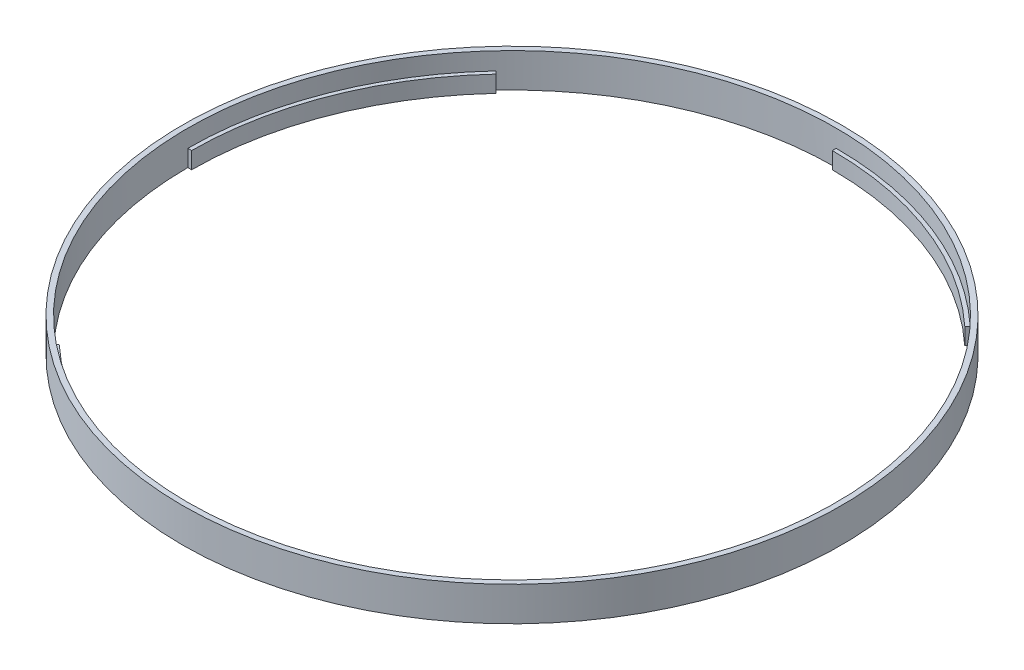
ISO-10303-21;
HEADER;
FILE_DESCRIPTION(('STEP AP214'),'2;1');
FILE_NAME('part.step','',(''),(''),'','','');
FILE_SCHEMA(('AUTOMOTIVE_DESIGN { 1 0 10303 214 1 1 1 1 }'));
ENDSEC;
DATA;
#1=APPLICATION_CONTEXT('core data for automotive mechanical design processes');
#2=APPLICATION_PROTOCOL_DEFINITION('international standard','automotive_design',2000,#1);
#3=PRODUCT_CONTEXT('',#1,'mechanical');
#4=PRODUCT('Part','Part','',(#3));
#5=PRODUCT_RELATED_PRODUCT_CATEGORY('part','',(#4));
#6=PRODUCT_DEFINITION_FORMATION('','',#4);
#7=PRODUCT_DEFINITION_CONTEXT('part definition',#1,'design');
#8=PRODUCT_DEFINITION('design','',#6,#7);
#9=PRODUCT_DEFINITION_SHAPE('','',#8);
#10=(LENGTH_UNIT() NAMED_UNIT(*) SI_UNIT(.MILLI.,.METRE.));
#11=(NAMED_UNIT(*) PLANE_ANGLE_UNIT() SI_UNIT($,.RADIAN.));
#12=(NAMED_UNIT(*) SI_UNIT($,.STERADIAN.) SOLID_ANGLE_UNIT());
#13=UNCERTAINTY_MEASURE_WITH_UNIT(LENGTH_MEASURE(1.E-05),#10,'distance_accuracy_value','');
#14=(GEOMETRIC_REPRESENTATION_CONTEXT(3) GLOBAL_UNCERTAINTY_ASSIGNED_CONTEXT((#13)) GLOBAL_UNIT_ASSIGNED_CONTEXT((#10,
#11,#12)) REPRESENTATION_CONTEXT('',''));
#15=CARTESIAN_POINT('',(0.,0.,0.));
#16=DIRECTION('',(0.,0.,1.));
#17=DIRECTION('',(1.,0.,0.));
#18=AXIS2_PLACEMENT_3D('',#15,#16,#17);
#19=CARTESIAN_POINT('',(0.,8.,0.));
#20=DIRECTION('',(0.,-1.,0.));
#21=DIRECTION('',(0.,0.,-1.));
#22=AXIS2_PLACEMENT_3D('',#19,#20,#21);
#23=CYLINDRICAL_SURFACE('',#22,75.75);
#24=CARTESIAN_POINT('',(0.,8.,0.));
#25=DIRECTION('',(0.,1.,0.));
#26=DIRECTION('',(0.,0.,1.));
#27=AXIS2_PLACEMENT_3D('',#24,#25,#26);
#28=CIRCLE('',#27,75.75);
#29=CARTESIAN_POINT('',(0.,8.,75.75));
#30=VERTEX_POINT('',#29);
#31=EDGE_CURVE('E255',#30,#30,#28,.T.);
#32=ORIENTED_EDGE('',*,*,#31,.T.);
#33=EDGE_LOOP('',(#32));
#34=FACE_BOUND('',#33,.T.);
#35=CARTESIAN_POINT('',(0.,0.,0.));
#36=DIRECTION('',(0.,1.,0.));
#37=DIRECTION('',(0.,0.,1.));
#38=AXIS2_PLACEMENT_3D('',#35,#36,#37);
#39=CIRCLE('',#38,75.75);
#40=CARTESIAN_POINT('',(-75.75,0.,0.));
#41=VERTEX_POINT('',#40);
#42=CARTESIAN_POINT('',(-51.6613757747343,0.,55.4000428976521));
#43=VERTEX_POINT('',#42);
#44=EDGE_CURVE('E169',#41,#43,#39,.T.);
#45=ORIENTED_EDGE('',*,*,#44,.F.);
#46=DIRECTION('',(0.,-1.,0.));
#47=VECTOR('',#46,1.);
#48=CARTESIAN_POINT('',(-75.75,3.9,0.));
#49=LINE('',#48,#47);
#50=CARTESIAN_POINT('',(-75.75,3.9,0.));
#51=VERTEX_POINT('',#50);
#52=EDGE_CURVE('E52',#51,#41,#49,.T.);
#53=ORIENTED_EDGE('',*,*,#52,.F.);
#54=CARTESIAN_POINT('',(0.,3.9,0.));
#55=DIRECTION('',(0.,1.,0.));
#56=DIRECTION('',(0.,0.,1.));
#57=AXIS2_PLACEMENT_3D('',#54,#55,#56);
#58=CIRCLE('',#57,75.75);
#59=CARTESIAN_POINT('',(-55.4000428976521,3.9,-51.6613757747343));
#60=VERTEX_POINT('',#59);
#61=EDGE_CURVE('E156',#60,#51,#58,.T.);
#62=ORIENTED_EDGE('',*,*,#61,.F.);
#63=DIRECTION('',(0.,-1.,0.));
#64=VECTOR('',#63,1.);
#65=CARTESIAN_POINT('',(-55.4000428976521,3.9,-51.6613757747343));
#66=LINE('',#65,#64);
#67=CARTESIAN_POINT('',(-55.4000428976521,0.,-51.6613757747343));
#68=VERTEX_POINT('',#67);
#69=EDGE_CURVE('E301',#60,#68,#66,.T.);
#70=ORIENTED_EDGE('',*,*,#69,.T.);
#71=CARTESIAN_POINT('',(0.,0.,-75.75));
#72=VERTEX_POINT('',#71);
#73=EDGE_CURVE('E258',#72,#68,#39,.T.);
#74=ORIENTED_EDGE('',*,*,#73,.F.);
#75=DIRECTION('',(0.,-1.,0.));
#76=VECTOR('',#75,1.);
#77=CARTESIAN_POINT('',(0.,3.9,-75.75));
#78=LINE('',#77,#76);
#79=CARTESIAN_POINT('',(0.,3.9,-75.75));
#80=VERTEX_POINT('',#79);
#81=EDGE_CURVE('E252',#80,#72,#78,.T.);
#82=ORIENTED_EDGE('',*,*,#81,.F.);
#83=CARTESIAN_POINT('',(0.,3.9,0.));
#84=DIRECTION('',(0.,1.,0.));
#85=DIRECTION('',(0.,0.,1.));
#86=AXIS2_PLACEMENT_3D('',#83,#84,#85);
#87=CIRCLE('',#86,75.75);
#88=CARTESIAN_POINT('',(51.6613757747343,3.9,-55.4000428976521));
#89=VERTEX_POINT('',#88);
#90=EDGE_CURVE('E228',#89,#80,#87,.T.);
#91=ORIENTED_EDGE('',*,*,#90,.F.);
#92=DIRECTION('',(0.,-1.,0.));
#93=VECTOR('',#92,1.);
#94=CARTESIAN_POINT('',(51.6613757747343,3.9,-55.4000428976521));
#95=LINE('',#94,#93);
#96=CARTESIAN_POINT('',(51.6613757747343,0.,-55.4000428976521));
#97=VERTEX_POINT('',#96);
#98=EDGE_CURVE('E238',#89,#97,#95,.T.);
#99=ORIENTED_EDGE('',*,*,#98,.T.);
#100=CARTESIAN_POINT('',(75.75,0.,0.));
#101=VERTEX_POINT('',#100);
#102=EDGE_CURVE('E254',#101,#97,#39,.T.);
#103=ORIENTED_EDGE('',*,*,#102,.F.);
#104=DIRECTION('',(0.,-1.,0.));
#105=VECTOR('',#104,1.);
#106=CARTESIAN_POINT('',(75.75,3.9,0.));
#107=LINE('',#106,#105);
#108=CARTESIAN_POINT('',(75.75,3.9,0.));
#109=VERTEX_POINT('',#108);
#110=EDGE_CURVE('E225',#109,#101,#107,.T.);
#111=ORIENTED_EDGE('',*,*,#110,.F.);
#112=CARTESIAN_POINT('',(0.,3.9,0.));
#113=DIRECTION('',(0.,1.,0.));
#114=DIRECTION('',(0.,0.,1.));
#115=AXIS2_PLACEMENT_3D('',#112,#113,#114);
#116=CIRCLE('',#115,75.75);
#117=CARTESIAN_POINT('',(55.4000428976521,3.9,51.6613757747343));
#118=VERTEX_POINT('',#117);
#119=EDGE_CURVE('E201',#118,#109,#116,.T.);
#120=ORIENTED_EDGE('',*,*,#119,.F.);
#121=DIRECTION('',(0.,-1.,0.));
#122=VECTOR('',#121,1.);
#123=CARTESIAN_POINT('',(55.4000428976521,3.9,51.6613757747343));
#124=LINE('',#123,#122);
#125=CARTESIAN_POINT('',(55.4000428976521,0.,51.6613757747343));
#126=VERTEX_POINT('',#125);
#127=EDGE_CURVE('E211',#118,#126,#124,.T.);
#128=ORIENTED_EDGE('',*,*,#127,.T.);
#129=CARTESIAN_POINT('',(0.,0.,75.75));
#130=VERTEX_POINT('',#129);
#131=EDGE_CURVE('E264',#130,#126,#39,.T.);
#132=ORIENTED_EDGE('',*,*,#131,.F.);
#133=DIRECTION('',(0.,-1.,0.));
#134=VECTOR('',#133,1.);
#135=CARTESIAN_POINT('',(0.,3.9,75.75));
#136=LINE('',#135,#134);
#137=CARTESIAN_POINT('',(0.,3.9,75.75));
#138=VERTEX_POINT('',#137);
#139=EDGE_CURVE('E60',#138,#130,#136,.T.);
#140=ORIENTED_EDGE('',*,*,#139,.F.);
#141=CARTESIAN_POINT('',(0.,3.9,0.));
#142=DIRECTION('',(0.,1.,0.));
#143=DIRECTION('',(0.,0.,1.));
#144=AXIS2_PLACEMENT_3D('',#141,#142,#143);
#145=CIRCLE('',#144,75.75);
#146=CARTESIAN_POINT('',(-51.6613757747343,3.9,55.4000428976521));
#147=VERTEX_POINT('',#146);
#148=EDGE_CURVE('E178',#147,#138,#145,.T.);
#149=ORIENTED_EDGE('',*,*,#148,.F.);
#150=DIRECTION('',(0.,-1.,0.));
#151=VECTOR('',#150,1.);
#152=CARTESIAN_POINT('',(-51.6613757747343,3.9,55.4000428976521));
#153=LINE('',#152,#151);
#154=EDGE_CURVE('E187',#147,#43,#153,.T.);
#155=ORIENTED_EDGE('',*,*,#154,.T.);
#156=EDGE_LOOP('',(#45,#53,#62,#70,#74,#82,#91,#99,#103,#111,#120,#128,#132,#140,#149,#155));
#157=FACE_BOUND('',#156,.T.);
#158=ADVANCED_FACE('F37',(#34,#157),#23,.F.);
#159=CARTESIAN_POINT('',(0.,8.,0.));
#160=DIRECTION('',(0.,1.,0.));
#161=DIRECTION('',(0.,0.,1.));
#162=AXIS2_PLACEMENT_3D('',#159,#160,#161);
#163=PLANE('',#162);
#164=CARTESIAN_POINT('',(0.,8.,0.));
#165=DIRECTION('',(0.,1.,0.));
#166=DIRECTION('',(0.,0.,1.));
#167=AXIS2_PLACEMENT_3D('',#164,#165,#166);
#168=CIRCLE('',#167,77.);
#169=CARTESIAN_POINT('',(0.,8.,77.));
#170=VERTEX_POINT('',#169);
#171=EDGE_CURVE('E11',#170,#170,#168,.T.);
#172=ORIENTED_EDGE('',*,*,#171,.T.);
#173=EDGE_LOOP('',(#172));
#174=FACE_BOUND('',#173,.T.);
#175=ORIENTED_EDGE('',*,*,#31,.F.);
#176=EDGE_LOOP('',(#175));
#177=FACE_BOUND('',#176,.T.);
#178=ADVANCED_FACE('F326',(#174,#177),#163,.T.);
#179=CARTESIAN_POINT('',(0.,0.,0.));
#180=DIRECTION('',(0.,1.,0.));
#181=DIRECTION('',(0.,0.,1.));
#182=AXIS2_PLACEMENT_3D('',#179,#180,#181);
#183=PLANE('',#182);
#184=CARTESIAN_POINT('',(0.,0.,0.));
#185=DIRECTION('',(0.,1.,0.));
#186=DIRECTION('',(0.,0.,1.));
#187=AXIS2_PLACEMENT_3D('',#184,#185,#186);
#188=CIRCLE('',#187,77.);
#189=CARTESIAN_POINT('',(0.,0.,77.));
#190=VERTEX_POINT('',#189);
#191=EDGE_CURVE('E41',#190,#190,#188,.T.);
#192=ORIENTED_EDGE('',*,*,#191,.F.);
#193=EDGE_LOOP('',(#192));
#194=FACE_BOUND('',#193,.T.);
#195=ORIENTED_EDGE('',*,*,#73,.T.);
#196=DIRECTION('',(-0.731353701619181,0.,-0.681998360062487));
#197=VECTOR('',#196,1.);
#198=CARTESIAN_POINT('',(-55.4000428976521,0.,-51.6613757747343));
#199=LINE('',#198,#197);
#200=CARTESIAN_POINT('',(-54.7418245661948,0.,-51.0475772506781));
#201=VERTEX_POINT('',#200);
#202=EDGE_CURVE('E165',#201,#68,#199,.T.);
#203=ORIENTED_EDGE('',*,*,#202,.F.);
#204=CARTESIAN_POINT('',(0.,0.,0.));
#205=DIRECTION('',(0.,-1.,0.));
#206=DIRECTION('',(0.,0.,1.));
#207=AXIS2_PLACEMENT_3D('',#204,#205,#206);
#208=CIRCLE('',#207,74.85);
#209=CARTESIAN_POINT('',(-74.85,0.,0.));
#210=VERTEX_POINT('',#209);
#211=EDGE_CURVE('E308',#210,#201,#208,.T.);
#212=ORIENTED_EDGE('',*,*,#211,.F.);
#213=DIRECTION('',(1.,0.,0.));
#214=VECTOR('',#213,1.);
#215=CARTESIAN_POINT('',(-75.75,0.,0.));
#216=LINE('',#215,#214);
#217=EDGE_CURVE('E310',#41,#210,#216,.T.);
#218=ORIENTED_EDGE('',*,*,#217,.F.);
#219=ORIENTED_EDGE('',*,*,#44,.T.);
#220=DIRECTION('',(-0.681998360062479,0.,0.731353701619189));
#221=VECTOR('',#220,1.);
#222=CARTESIAN_POINT('',(-51.6613757747343,0.,55.4000428976521));
#223=LINE('',#222,#221);
#224=CARTESIAN_POINT('',(-51.0475772506781,0.,54.7418245661948));
#225=VERTEX_POINT('',#224);
#226=EDGE_CURVE('E182',#225,#43,#223,.T.);
#227=ORIENTED_EDGE('',*,*,#226,.F.);
#228=CARTESIAN_POINT('',(0.,0.,0.));
#229=DIRECTION('',(0.,-1.,0.));
#230=DIRECTION('',(0.,0.,1.));
#231=AXIS2_PLACEMENT_3D('',#228,#229,#230);
#232=CIRCLE('',#231,74.85);
#233=CARTESIAN_POINT('',(0.,0.,74.85));
#234=VERTEX_POINT('',#233);
#235=EDGE_CURVE('E172',#234,#225,#232,.T.);
#236=ORIENTED_EDGE('',*,*,#235,.F.);
#237=DIRECTION('',(0.,0.,-1.));
#238=VECTOR('',#237,1.);
#239=CARTESIAN_POINT('',(0.,0.,75.75));
#240=LINE('',#239,#238);
#241=EDGE_CURVE('E170',#130,#234,#240,.T.);
#242=ORIENTED_EDGE('',*,*,#241,.F.);
#243=ORIENTED_EDGE('',*,*,#131,.T.);
#244=DIRECTION('',(0.731353701619181,0.,0.681998360062487));
#245=VECTOR('',#244,1.);
#246=CARTESIAN_POINT('',(55.4000428976521,0.,51.6613757747343));
#247=LINE('',#246,#245);
#248=CARTESIAN_POINT('',(54.7418245661948,0.,51.0475772506781));
#249=VERTEX_POINT('',#248);
#250=EDGE_CURVE('E205',#249,#126,#247,.T.);
#251=ORIENTED_EDGE('',*,*,#250,.F.);
#252=CARTESIAN_POINT('',(0.,0.,0.));
#253=DIRECTION('',(0.,-1.,0.));
#254=DIRECTION('',(0.,0.,1.));
#255=AXIS2_PLACEMENT_3D('',#252,#253,#254);
#256=CIRCLE('',#255,74.85);
#257=CARTESIAN_POINT('',(74.85,0.,0.));
#258=VERTEX_POINT('',#257);
#259=EDGE_CURVE('E213',#258,#249,#256,.T.);
#260=ORIENTED_EDGE('',*,*,#259,.F.);
#261=DIRECTION('',(-1.,0.,0.));
#262=VECTOR('',#261,1.);
#263=CARTESIAN_POINT('',(75.75,0.,0.));
#264=LINE('',#263,#262);
#265=EDGE_CURVE('E200',#101,#258,#264,.T.);
#266=ORIENTED_EDGE('',*,*,#265,.F.);
#267=ORIENTED_EDGE('',*,*,#102,.T.);
#268=DIRECTION('',(0.681998360062487,0.,-0.731353701619181));
#269=VECTOR('',#268,1.);
#270=CARTESIAN_POINT('',(51.6613757747343,0.,-55.4000428976521));
#271=LINE('',#270,#269);
#272=CARTESIAN_POINT('',(51.0475772506781,0.,-54.7418245661948));
#273=VERTEX_POINT('',#272);
#274=EDGE_CURVE('E232',#273,#97,#271,.T.);
#275=ORIENTED_EDGE('',*,*,#274,.F.);
#276=CARTESIAN_POINT('',(0.,0.,0.));
#277=DIRECTION('',(0.,-1.,0.));
#278=DIRECTION('',(0.,0.,1.));
#279=AXIS2_PLACEMENT_3D('',#276,#277,#278);
#280=CIRCLE('',#279,74.85);
#281=CARTESIAN_POINT('',(0.,0.,-74.85));
#282=VERTEX_POINT('',#281);
#283=EDGE_CURVE('E240',#282,#273,#280,.T.);
#284=ORIENTED_EDGE('',*,*,#283,.F.);
#285=DIRECTION('',(0.,0.,1.));
#286=VECTOR('',#285,1.);
#287=CARTESIAN_POINT('',(0.,0.,-75.75));
#288=LINE('',#287,#286);
#289=EDGE_CURVE('E227',#72,#282,#288,.T.);
#290=ORIENTED_EDGE('',*,*,#289,.F.);
#291=EDGE_LOOP('',(#195,#203,#212,#218,#219,#227,#236,#242,#243,#251,#260,#266,#267,#275,#284,#290));
#292=FACE_BOUND('',#291,.T.);
#293=ADVANCED_FACE('F270',(#194,#292),#183,.F.);
#294=CARTESIAN_POINT('',(0.,8.,0.));
#295=DIRECTION('',(0.,-1.,0.));
#296=DIRECTION('',(0.,0.,-1.));
#297=AXIS2_PLACEMENT_3D('',#294,#295,#296);
#298=CYLINDRICAL_SURFACE('',#297,77.);
#299=ORIENTED_EDGE('',*,*,#171,.F.);
#300=EDGE_LOOP('',(#299));
#301=FACE_BOUND('',#300,.T.);
#302=ORIENTED_EDGE('',*,*,#191,.T.);
#303=EDGE_LOOP('',(#302));
#304=FACE_BOUND('',#303,.T.);
#305=ADVANCED_FACE('F39',(#301,#304),#298,.T.);
#306=CARTESIAN_POINT('',(0.,3.9,-75.75));
#307=DIRECTION('',(1.,0.,0.));
#308=DIRECTION('',(0.,0.,-1.));
#309=AXIS2_PLACEMENT_3D('',#306,#307,#308);
#310=PLANE('',#309);
#311=ORIENTED_EDGE('',*,*,#289,.T.);
#312=DIRECTION('',(0.,-1.,0.));
#313=VECTOR('',#312,1.);
#314=CARTESIAN_POINT('',(0.,3.9,-74.85));
#315=LINE('',#314,#313);
#316=CARTESIAN_POINT('',(0.,3.9,-74.85));
#317=VERTEX_POINT('',#316);
#318=EDGE_CURVE('E249',#317,#282,#315,.T.);
#319=ORIENTED_EDGE('',*,*,#318,.F.);
#320=DIRECTION('',(0.,0.,1.));
#321=VECTOR('',#320,1.);
#322=CARTESIAN_POINT('',(0.,3.9,-75.75));
#323=LINE('',#322,#321);
#324=EDGE_CURVE('E231',#80,#317,#323,.T.);
#325=ORIENTED_EDGE('',*,*,#324,.F.);
#326=ORIENTED_EDGE('',*,*,#81,.T.);
#327=EDGE_LOOP('',(#311,#319,#325,#326));
#328=FACE_BOUND('',#327,.T.);
#329=ADVANCED_FACE('F300',(#328),#310,.F.);
#330=CARTESIAN_POINT('',(0.,3.9,0.));
#331=DIRECTION('',(0.,-1.,0.));
#332=DIRECTION('',(0.,0.,-1.));
#333=AXIS2_PLACEMENT_3D('',#330,#331,#332);
#334=CYLINDRICAL_SURFACE('',#333,74.85);
#335=ORIENTED_EDGE('',*,*,#283,.T.);
#336=DIRECTION('',(0.,-1.,0.));
#337=VECTOR('',#336,1.);
#338=CARTESIAN_POINT('',(51.0475772506781,3.9,-54.7418245661948));
#339=LINE('',#338,#337);
#340=CARTESIAN_POINT('',(51.0475772506781,3.9,-54.7418245661948));
#341=VERTEX_POINT('',#340);
#342=EDGE_CURVE('E246',#341,#273,#339,.T.);
#343=ORIENTED_EDGE('',*,*,#342,.F.);
#344=CARTESIAN_POINT('',(0.,3.9,0.));
#345=DIRECTION('',(0.,-1.,0.));
#346=DIRECTION('',(0.,0.,1.));
#347=AXIS2_PLACEMENT_3D('',#344,#345,#346);
#348=CIRCLE('',#347,74.85);
#349=EDGE_CURVE('E234',#317,#341,#348,.T.);
#350=ORIENTED_EDGE('',*,*,#349,.F.);
#351=ORIENTED_EDGE('',*,*,#318,.T.);
#352=EDGE_LOOP('',(#335,#343,#350,#351));
#353=FACE_BOUND('',#352,.T.);
#354=ADVANCED_FACE('F296',(#353),#334,.F.);
#355=CARTESIAN_POINT('',(51.6613757747343,3.9,-55.4000428976521));
#356=DIRECTION('',(-0.731353701619181,0.,-0.681998360062487));
#357=DIRECTION('',(-0.681998360062487,0.,0.731353701619181));
#358=AXIS2_PLACEMENT_3D('',#355,#356,#357);
#359=PLANE('',#358);
#360=ORIENTED_EDGE('',*,*,#274,.T.);
#361=ORIENTED_EDGE('',*,*,#98,.F.);
#362=DIRECTION('',(0.681998360062487,0.,-0.731353701619181));
#363=VECTOR('',#362,1.);
#364=CARTESIAN_POINT('',(51.6613757747343,3.9,-55.4000428976521));
#365=LINE('',#364,#363);
#366=EDGE_CURVE('E236',#341,#89,#365,.T.);
#367=ORIENTED_EDGE('',*,*,#366,.F.);
#368=ORIENTED_EDGE('',*,*,#342,.T.);
#369=EDGE_LOOP('',(#360,#361,#367,#368));
#370=FACE_BOUND('',#369,.T.);
#371=ADVANCED_FACE('F292',(#370),#359,.F.);
#372=CARTESIAN_POINT('',(0.,3.9,0.));
#373=DIRECTION('',(0.,1.,0.));
#374=DIRECTION('',(0.,0.,1.));
#375=AXIS2_PLACEMENT_3D('',#372,#373,#374);
#376=PLANE('',#375);
#377=ORIENTED_EDGE('',*,*,#90,.T.);
#378=ORIENTED_EDGE('',*,*,#324,.T.);
#379=ORIENTED_EDGE('',*,*,#349,.T.);
#380=ORIENTED_EDGE('',*,*,#366,.T.);
#381=EDGE_LOOP('',(#377,#378,#379,#380));
#382=FACE_BOUND('',#381,.T.);
#383=ADVANCED_FACE('F357',(#382),#376,.T.);
#384=CARTESIAN_POINT('',(75.75,3.9,0.));
#385=DIRECTION('',(0.,0.,1.));
#386=DIRECTION('',(1.,0.,0.));
#387=AXIS2_PLACEMENT_3D('',#384,#385,#386);
#388=PLANE('',#387);
#389=ORIENTED_EDGE('',*,*,#265,.T.);
#390=DIRECTION('',(0.,-1.,0.));
#391=VECTOR('',#390,1.);
#392=CARTESIAN_POINT('',(74.85,3.9,0.));
#393=LINE('',#392,#391);
#394=CARTESIAN_POINT('',(74.85,3.9,0.));
#395=VERTEX_POINT('',#394);
#396=EDGE_CURVE('E222',#395,#258,#393,.T.);
#397=ORIENTED_EDGE('',*,*,#396,.F.);
#398=DIRECTION('',(-1.,0.,0.));
#399=VECTOR('',#398,1.);
#400=CARTESIAN_POINT('',(75.75,3.9,0.));
#401=LINE('',#400,#399);
#402=EDGE_CURVE('E204',#109,#395,#401,.T.);
#403=ORIENTED_EDGE('',*,*,#402,.F.);
#404=ORIENTED_EDGE('',*,*,#110,.T.);
#405=EDGE_LOOP('',(#389,#397,#403,#404));
#406=FACE_BOUND('',#405,.T.);
#407=ADVANCED_FACE('F362',(#406),#388,.F.);
#408=CARTESIAN_POINT('',(0.,3.9,0.));
#409=DIRECTION('',(0.,-1.,0.));
#410=DIRECTION('',(0.,0.,-1.));
#411=AXIS2_PLACEMENT_3D('',#408,#409,#410);
#412=CYLINDRICAL_SURFACE('',#411,74.85);
#413=ORIENTED_EDGE('',*,*,#259,.T.);
#414=DIRECTION('',(0.,-1.,0.));
#415=VECTOR('',#414,1.);
#416=CARTESIAN_POINT('',(54.7418245661948,3.9,51.0475772506781));
#417=LINE('',#416,#415);
#418=CARTESIAN_POINT('',(54.7418245661948,3.9,51.0475772506781));
#419=VERTEX_POINT('',#418);
#420=EDGE_CURVE('E219',#419,#249,#417,.T.);
#421=ORIENTED_EDGE('',*,*,#420,.F.);
#422=CARTESIAN_POINT('',(0.,3.9,0.));
#423=DIRECTION('',(0.,-1.,0.));
#424=DIRECTION('',(0.,0.,1.));
#425=AXIS2_PLACEMENT_3D('',#422,#423,#424);
#426=CIRCLE('',#425,74.85);
#427=EDGE_CURVE('E207',#395,#419,#426,.T.);
#428=ORIENTED_EDGE('',*,*,#427,.F.);
#429=ORIENTED_EDGE('',*,*,#396,.T.);
#430=EDGE_LOOP('',(#413,#421,#428,#429));
#431=FACE_BOUND('',#430,.T.);
#432=ADVANCED_FACE('F285',(#431),#412,.F.);
#433=CARTESIAN_POINT('',(55.4000428976521,3.9,51.6613757747343));
#434=DIRECTION('',(0.681998360062487,0.,-0.731353701619181));
#435=DIRECTION('',(-0.731353701619181,0.,-0.681998360062487));
#436=AXIS2_PLACEMENT_3D('',#433,#434,#435);
#437=PLANE('',#436);
#438=ORIENTED_EDGE('',*,*,#250,.T.);
#439=ORIENTED_EDGE('',*,*,#127,.F.);
#440=DIRECTION('',(0.731353701619181,0.,0.681998360062487));
#441=VECTOR('',#440,1.);
#442=CARTESIAN_POINT('',(55.4000428976521,3.9,51.6613757747343));
#443=LINE('',#442,#441);
#444=EDGE_CURVE('E209',#419,#118,#443,.T.);
#445=ORIENTED_EDGE('',*,*,#444,.F.);
#446=ORIENTED_EDGE('',*,*,#420,.T.);
#447=EDGE_LOOP('',(#438,#439,#445,#446));
#448=FACE_BOUND('',#447,.T.);
#449=ADVANCED_FACE('F275',(#448),#437,.F.);
#450=CARTESIAN_POINT('',(0.,3.9,0.));
#451=DIRECTION('',(0.,1.,0.));
#452=DIRECTION('',(0.,0.,1.));
#453=AXIS2_PLACEMENT_3D('',#450,#451,#452);
#454=PLANE('',#453);
#455=ORIENTED_EDGE('',*,*,#119,.T.);
#456=ORIENTED_EDGE('',*,*,#402,.T.);
#457=ORIENTED_EDGE('',*,*,#427,.T.);
#458=ORIENTED_EDGE('',*,*,#444,.T.);
#459=EDGE_LOOP('',(#455,#456,#457,#458));
#460=FACE_BOUND('',#459,.T.);
#461=ADVANCED_FACE('F281',(#460),#454,.T.);
#462=CARTESIAN_POINT('',(0.,3.9,75.75));
#463=DIRECTION('',(-1.,0.,0.));
#464=DIRECTION('',(0.,0.,1.));
#465=AXIS2_PLACEMENT_3D('',#462,#463,#464);
#466=PLANE('',#465);
#467=ORIENTED_EDGE('',*,*,#241,.T.);
#468=DIRECTION('',(0.,-1.,0.));
#469=VECTOR('',#468,1.);
#470=CARTESIAN_POINT('',(0.,3.9,74.85));
#471=LINE('',#470,#469);
#472=CARTESIAN_POINT('',(0.,3.9,74.85));
#473=VERTEX_POINT('',#472);
#474=EDGE_CURVE('E196',#473,#234,#471,.T.);
#475=ORIENTED_EDGE('',*,*,#474,.F.);
#476=DIRECTION('',(0.,0.,-1.));
#477=VECTOR('',#476,1.);
#478=CARTESIAN_POINT('',(0.,3.9,75.75));
#479=LINE('',#478,#477);
#480=EDGE_CURVE('E181',#138,#473,#479,.T.);
#481=ORIENTED_EDGE('',*,*,#480,.F.);
#482=ORIENTED_EDGE('',*,*,#139,.T.);
#483=EDGE_LOOP('',(#467,#475,#481,#482));
#484=FACE_BOUND('',#483,.T.);
#485=ADVANCED_FACE('F372',(#484),#466,.F.);
#486=CARTESIAN_POINT('',(0.,3.9,0.));
#487=DIRECTION('',(0.,-1.,0.));
#488=DIRECTION('',(0.,0.,-1.));
#489=AXIS2_PLACEMENT_3D('',#486,#487,#488);
#490=CYLINDRICAL_SURFACE('',#489,74.85);
#491=ORIENTED_EDGE('',*,*,#235,.T.);
#492=DIRECTION('',(0.,-1.,0.));
#493=VECTOR('',#492,1.);
#494=CARTESIAN_POINT('',(-51.0475772506781,3.9,54.7418245661948));
#495=LINE('',#494,#493);
#496=CARTESIAN_POINT('',(-51.0475772506781,3.9,54.7418245661948));
#497=VERTEX_POINT('',#496);
#498=EDGE_CURVE('E193',#497,#225,#495,.T.);
#499=ORIENTED_EDGE('',*,*,#498,.F.);
#500=CARTESIAN_POINT('',(0.,3.9,0.));
#501=DIRECTION('',(0.,-1.,0.));
#502=DIRECTION('',(0.,0.,1.));
#503=AXIS2_PLACEMENT_3D('',#500,#501,#502);
#504=CIRCLE('',#503,74.85);
#505=EDGE_CURVE('E184',#473,#497,#504,.T.);
#506=ORIENTED_EDGE('',*,*,#505,.F.);
#507=ORIENTED_EDGE('',*,*,#474,.T.);
#508=EDGE_LOOP('',(#491,#499,#506,#507));
#509=FACE_BOUND('',#508,.T.);
#510=ADVANCED_FACE('F375',(#509),#490,.F.);
#511=CARTESIAN_POINT('',(-51.6613757747343,3.9,55.4000428976521));
#512=DIRECTION('',(0.731353701619189,0.,0.681998360062479));
#513=DIRECTION('',(0.681998360062479,0.,-0.731353701619189));
#514=AXIS2_PLACEMENT_3D('',#511,#512,#513);
#515=PLANE('',#514);
#516=ORIENTED_EDGE('',*,*,#226,.T.);
#517=ORIENTED_EDGE('',*,*,#154,.F.);
#518=DIRECTION('',(-0.681998360062479,0.,0.731353701619189));
#519=VECTOR('',#518,1.);
#520=CARTESIAN_POINT('',(-51.6613757747343,3.9,55.4000428976521));
#521=LINE('',#520,#519);
#522=EDGE_CURVE('E186',#497,#147,#521,.T.);
#523=ORIENTED_EDGE('',*,*,#522,.F.);
#524=ORIENTED_EDGE('',*,*,#498,.T.);
#525=EDGE_LOOP('',(#516,#517,#523,#524));
#526=FACE_BOUND('',#525,.T.);
#527=ADVANCED_FACE('F378',(#526),#515,.F.);
#528=CARTESIAN_POINT('',(0.,3.9,0.));
#529=DIRECTION('',(0.,1.,0.));
#530=DIRECTION('',(0.,0.,1.));
#531=AXIS2_PLACEMENT_3D('',#528,#529,#530);
#532=PLANE('',#531);
#533=ORIENTED_EDGE('',*,*,#148,.T.);
#534=ORIENTED_EDGE('',*,*,#480,.T.);
#535=ORIENTED_EDGE('',*,*,#505,.T.);
#536=ORIENTED_EDGE('',*,*,#522,.T.);
#537=EDGE_LOOP('',(#533,#534,#535,#536));
#538=FACE_BOUND('',#537,.T.);
#539=ADVANCED_FACE('F382',(#538),#532,.T.);
#540=CARTESIAN_POINT('',(-75.75,3.9,0.));
#541=DIRECTION('',(0.,0.,-1.));
#542=DIRECTION('',(-1.,0.,0.));
#543=AXIS2_PLACEMENT_3D('',#540,#541,#542);
#544=PLANE('',#543);
#545=ORIENTED_EDGE('',*,*,#217,.T.);
#546=DIRECTION('',(0.,-1.,0.));
#547=VECTOR('',#546,1.);
#548=CARTESIAN_POINT('',(-74.85,3.9,0.));
#549=LINE('',#548,#547);
#550=CARTESIAN_POINT('',(-74.85,3.9,0.));
#551=VERTEX_POINT('',#550);
#552=EDGE_CURVE('E152',#551,#210,#549,.T.);
#553=ORIENTED_EDGE('',*,*,#552,.F.);
#554=DIRECTION('',(1.,0.,0.));
#555=VECTOR('',#554,1.);
#556=CARTESIAN_POINT('',(-75.75,3.9,0.));
#557=LINE('',#556,#555);
#558=EDGE_CURVE('E148',#51,#551,#557,.T.);
#559=ORIENTED_EDGE('',*,*,#558,.F.);
#560=ORIENTED_EDGE('',*,*,#52,.T.);
#561=EDGE_LOOP('',(#545,#553,#559,#560));
#562=FACE_BOUND('',#561,.T.);
#563=ADVANCED_FACE('F150',(#562),#544,.F.);
#564=CARTESIAN_POINT('',(0.,3.9,0.));
#565=DIRECTION('',(0.,-1.,0.));
#566=DIRECTION('',(0.,0.,-1.));
#567=AXIS2_PLACEMENT_3D('',#564,#565,#566);
#568=CYLINDRICAL_SURFACE('',#567,74.85);
#569=ORIENTED_EDGE('',*,*,#211,.T.);
#570=DIRECTION('',(0.,-1.,0.));
#571=VECTOR('',#570,1.);
#572=CARTESIAN_POINT('',(-54.7418245661948,3.9,-51.0475772506781));
#573=LINE('',#572,#571);
#574=CARTESIAN_POINT('',(-54.7418245661948,3.9,-51.0475772506781));
#575=VERTEX_POINT('',#574);
#576=EDGE_CURVE('E174',#575,#201,#573,.T.);
#577=ORIENTED_EDGE('',*,*,#576,.F.);
#578=CARTESIAN_POINT('',(0.,3.9,0.));
#579=DIRECTION('',(0.,-1.,0.));
#580=DIRECTION('',(0.,0.,1.));
#581=AXIS2_PLACEMENT_3D('',#578,#579,#580);
#582=CIRCLE('',#581,74.85);
#583=EDGE_CURVE('E155',#551,#575,#582,.T.);
#584=ORIENTED_EDGE('',*,*,#583,.F.);
#585=ORIENTED_EDGE('',*,*,#552,.T.);
#586=EDGE_LOOP('',(#569,#577,#584,#585));
#587=FACE_BOUND('',#586,.T.);
#588=ADVANCED_FACE('F314',(#587),#568,.F.);
#589=CARTESIAN_POINT('',(-55.4000428976521,3.9,-51.6613757747343));
#590=DIRECTION('',(-0.681998360062487,0.,0.731353701619181));
#591=DIRECTION('',(0.731353701619181,0.,0.681998360062487));
#592=AXIS2_PLACEMENT_3D('',#589,#590,#591);
#593=PLANE('',#592);
#594=ORIENTED_EDGE('',*,*,#202,.T.);
#595=ORIENTED_EDGE('',*,*,#69,.F.);
#596=DIRECTION('',(-0.731353701619181,0.,-0.681998360062487));
#597=VECTOR('',#596,1.);
#598=CARTESIAN_POINT('',(-55.4000428976521,3.9,-51.6613757747343));
#599=LINE('',#598,#597);
#600=EDGE_CURVE('E161',#575,#60,#599,.T.);
#601=ORIENTED_EDGE('',*,*,#600,.F.);
#602=ORIENTED_EDGE('',*,*,#576,.T.);
#603=EDGE_LOOP('',(#594,#595,#601,#602));
#604=FACE_BOUND('',#603,.T.);
#605=ADVANCED_FACE('F316',(#604),#593,.F.);
#606=CARTESIAN_POINT('',(0.,3.9,0.));
#607=DIRECTION('',(0.,1.,0.));
#608=DIRECTION('',(0.,0.,1.));
#609=AXIS2_PLACEMENT_3D('',#606,#607,#608);
#610=PLANE('',#609);
#611=ORIENTED_EDGE('',*,*,#61,.T.);
#612=ORIENTED_EDGE('',*,*,#558,.T.);
#613=ORIENTED_EDGE('',*,*,#583,.T.);
#614=ORIENTED_EDGE('',*,*,#600,.T.);
#615=EDGE_LOOP('',(#611,#612,#613,#614));
#616=FACE_BOUND('',#615,.T.);
#617=ADVANCED_FACE('F159',(#616),#610,.T.);
#618=CLOSED_SHELL('',(#158,#178,#293,#305,#329,#354,#371,#383,#407,#432,#449,#461,#485,#510,
#527,#539,#563,#588,#605,#617));
#619=MANIFOLD_SOLID_BREP('B2',#618);
#620=ADVANCED_BREP_SHAPE_REPRESENTATION('',(#18,#619),#14);
#621=SHAPE_DEFINITION_REPRESENTATION(#9,#620);
ENDSEC;
END-ISO-10303-21;
